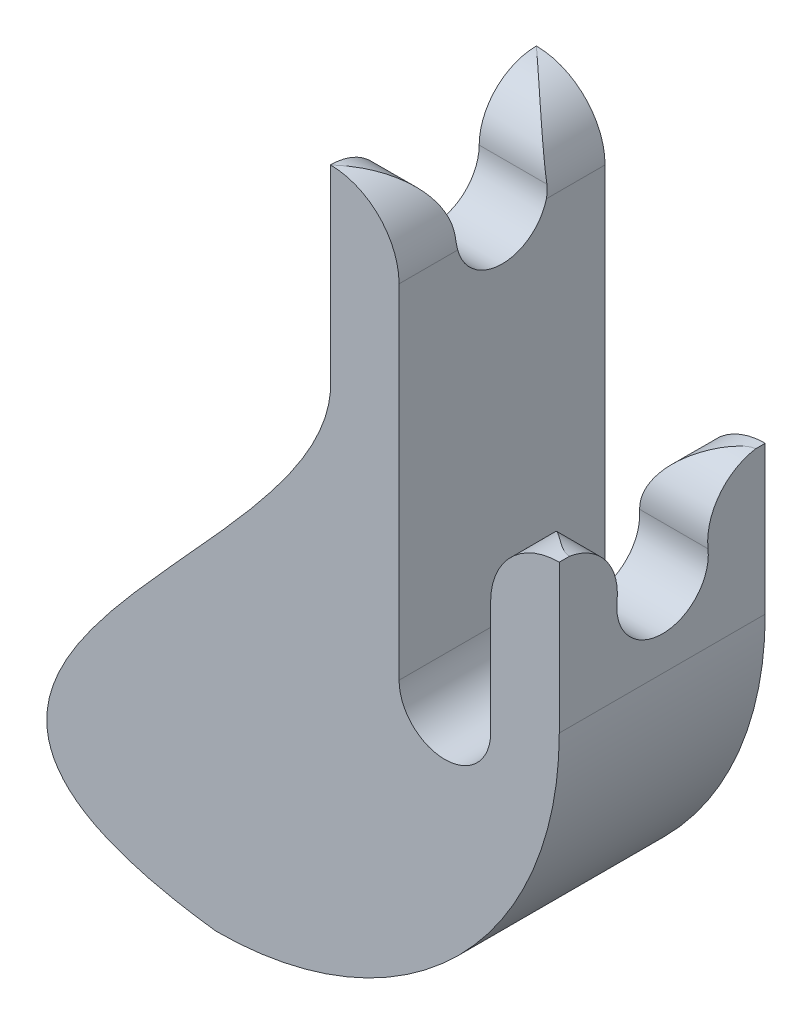
ISO-10303-21;
HEADER;
FILE_DESCRIPTION(('STEP AP214'),'2;1');
FILE_NAME('part.step','',(''),(''),'','','');
FILE_SCHEMA(('AUTOMOTIVE_DESIGN { 1 0 10303 214 1 1 1 1 }'));
ENDSEC;
DATA;
#1=APPLICATION_CONTEXT('core data for automotive mechanical design processes');
#2=APPLICATION_PROTOCOL_DEFINITION('international standard','automotive_design',2000,#1);
#3=PRODUCT_CONTEXT('',#1,'mechanical');
#4=PRODUCT('Part','Part','',(#3));
#5=PRODUCT_RELATED_PRODUCT_CATEGORY('part','',(#4));
#6=PRODUCT_DEFINITION_FORMATION('','',#4);
#7=PRODUCT_DEFINITION_CONTEXT('part definition',#1,'design');
#8=PRODUCT_DEFINITION('design','',#6,#7);
#9=PRODUCT_DEFINITION_SHAPE('','',#8);
#10=(LENGTH_UNIT() NAMED_UNIT(*) SI_UNIT(.MILLI.,.METRE.));
#11=(NAMED_UNIT(*) PLANE_ANGLE_UNIT() SI_UNIT($,.RADIAN.));
#12=(NAMED_UNIT(*) SI_UNIT($,.STERADIAN.) SOLID_ANGLE_UNIT());
#13=UNCERTAINTY_MEASURE_WITH_UNIT(LENGTH_MEASURE(1.E-05),#10,'distance_accuracy_value','');
#14=(GEOMETRIC_REPRESENTATION_CONTEXT(3) GLOBAL_UNCERTAINTY_ASSIGNED_CONTEXT((#13)) GLOBAL_UNIT_ASSIGNED_CONTEXT((#10,
#11,#12)) REPRESENTATION_CONTEXT('',''));
#15=CARTESIAN_POINT('',(0.,0.,0.));
#16=DIRECTION('',(0.,0.,1.));
#17=DIRECTION('',(1.,0.,0.));
#18=AXIS2_PLACEMENT_3D('',#15,#16,#17);
#19=CARTESIAN_POINT('',(0.,0.,9.));
#20=DIRECTION('',(0.,0.,1.));
#21=DIRECTION('',(1.,0.,0.));
#22=AXIS2_PLACEMENT_3D('',#19,#20,#21);
#23=PLANE('',#22);
#24=DIRECTION('',(0.,1.,0.));
#25=VECTOR('',#24,1.);
#26=CARTESIAN_POINT('',(0.,0.,9.));
#27=LINE('',#26,#25);
#28=CARTESIAN_POINT('',(0.,7.5,9.));
#29=VERTEX_POINT('',#28);
#30=CARTESIAN_POINT('',(0.,13.9665918901045,9.));
#31=VERTEX_POINT('',#30);
#32=EDGE_CURVE('E283',#29,#31,#27,.T.);
#33=ORIENTED_EDGE('',*,*,#32,.T.);
#34=CARTESIAN_POINT('',(0.,10.9665918901045,9.));
#35=DIRECTION('',(0.,0.,1.));
#36=DIRECTION('',(-1.,0.,0.));
#37=AXIS2_PLACEMENT_3D('',#34,#35,#36);
#38=CIRCLE('',#37,2.99999999999998);
#39=CARTESIAN_POINT('',(-2.99999999999999,10.9665918901045,9.));
#40=VERTEX_POINT('',#39);
#41=EDGE_CURVE('E285',#31,#40,#38,.T.);
#42=ORIENTED_EDGE('',*,*,#41,.T.);
#43=DIRECTION('',(0.,-1.,0.));
#44=VECTOR('',#43,1.);
#45=CARTESIAN_POINT('',(-2.99999999999999,6.,9.));
#46=LINE('',#45,#44);
#47=CARTESIAN_POINT('',(-2.99999999999999,5.99999999999999,9.));
#48=VERTEX_POINT('',#47);
#49=EDGE_CURVE('E362',#40,#48,#46,.T.);
#50=ORIENTED_EDGE('',*,*,#49,.T.);
#51=CARTESIAN_POINT('',(-4.99999999999999,5.99999999999999,9.));
#52=DIRECTION('',(0.,0.,-1.));
#53=DIRECTION('',(1.,0.,0.));
#54=AXIS2_PLACEMENT_3D('',#51,#52,#53);
#55=CIRCLE('',#54,2.);
#56=CARTESIAN_POINT('',(-6.99999999999999,6.,9.));
#57=VERTEX_POINT('',#56);
#58=EDGE_CURVE('E365',#48,#57,#55,.T.);
#59=ORIENTED_EDGE('',*,*,#58,.T.);
#60=DIRECTION('',(0.,1.,0.));
#61=VECTOR('',#60,1.);
#62=CARTESIAN_POINT('',(-6.99999999999999,6.,9.));
#63=LINE('',#62,#61);
#64=CARTESIAN_POINT('',(-7.00000000000001,21.,9.));
#65=VERTEX_POINT('',#64);
#66=EDGE_CURVE('E367',#57,#65,#63,.T.);
#67=ORIENTED_EDGE('',*,*,#66,.T.);
#68=CARTESIAN_POINT('',(-10.,21.,9.));
#69=DIRECTION('',(0.,0.,1.));
#70=DIRECTION('',(1.,0.,0.));
#71=AXIS2_PLACEMENT_3D('',#68,#69,#70);
#72=CIRCLE('',#71,3.00000000000002);
#73=CARTESIAN_POINT('',(-9.99999999999983,24.,9.));
#74=VERTEX_POINT('',#73);
#75=EDGE_CURVE('E343',#65,#74,#72,.T.);
#76=ORIENTED_EDGE('',*,*,#75,.T.);
#77=DIRECTION('',(0.,1.,0.));
#78=VECTOR('',#77,1.);
#79=CARTESIAN_POINT('',(-9.99999999999979,0.,9.));
#80=LINE('',#79,#78);
#81=CARTESIAN_POINT('',(-10.,15.4143003152786,9.00000000000001));
#82=VERTEX_POINT('',#81);
#83=EDGE_CURVE('E11',#82,#74,#80,.T.);
#84=ORIENTED_EDGE('',*,*,#83,.F.);
#85=CARTESIAN_POINT('',(-10.,15.4143003152786,9.00000000000001));
#86=CARTESIAN_POINT('',(-10.6888579902021,7.78047139706958,9.00000000000001));
#87=CARTESIAN_POINT('',(-33.9007527158929,-5.1147055231354,9.00000000000001));
#88=CARTESIAN_POINT('',(-15.,-7.5,9.00000000000001));
#89=B_SPLINE_CURVE_WITH_KNOTS('',3,(#85,#86,#87,#88),.UNSPECIFIED.,.F.,.F.,(4,4),(0.,1.),.UNSPECIFIED.);
#90=CARTESIAN_POINT('',(-15.,-7.5,9.));
#91=VERTEX_POINT('',#90);
#92=EDGE_CURVE('E291',#82,#91,#89,.T.);
#93=ORIENTED_EDGE('',*,*,#92,.T.);
#94=CARTESIAN_POINT('',(-15.,7.5,9.));
#95=DIRECTION('',(0.,0.,1.));
#96=DIRECTION('',(1.,0.,0.));
#97=AXIS2_PLACEMENT_3D('',#94,#95,#96);
#98=CIRCLE('',#97,15.);
#99=EDGE_CURVE('E79',#91,#29,#98,.T.);
#100=ORIENTED_EDGE('',*,*,#99,.T.);
#101=EDGE_LOOP('',(#33,#42,#50,#59,#67,#76,#84,#93,#100));
#102=FACE_BOUND('',#101,.T.);
#103=ADVANCED_FACE('F34',(#102),#23,.T.);
#104=CARTESIAN_POINT('',(0.,0.,0.));
#105=DIRECTION('',(0.,0.,1.));
#106=DIRECTION('',(1.,0.,0.));
#107=AXIS2_PLACEMENT_3D('',#104,#105,#106);
#108=PLANE('',#107);
#109=CARTESIAN_POINT('',(-10.,21.,0.));
#110=DIRECTION('',(0.,0.,1.));
#111=DIRECTION('',(1.,0.,0.));
#112=AXIS2_PLACEMENT_3D('',#109,#110,#111);
#113=CIRCLE('',#112,3.00000000000002);
#114=CARTESIAN_POINT('',(-7.00000000000001,21.,0.));
#115=VERTEX_POINT('',#114);
#116=CARTESIAN_POINT('',(-9.99999999999983,24.,0.));
#117=VERTEX_POINT('',#116);
#118=EDGE_CURVE('E354',#115,#117,#113,.T.);
#119=ORIENTED_EDGE('',*,*,#118,.F.);
#120=DIRECTION('',(0.,1.,0.));
#121=VECTOR('',#120,1.);
#122=CARTESIAN_POINT('',(-6.99999999999999,6.,0.));
#123=LINE('',#122,#121);
#124=CARTESIAN_POINT('',(-6.99999999999999,6.,0.));
#125=VERTEX_POINT('',#124);
#126=EDGE_CURVE('E334',#125,#115,#123,.T.);
#127=ORIENTED_EDGE('',*,*,#126,.F.);
#128=CARTESIAN_POINT('',(-4.99999999999999,5.99999999999999,0.));
#129=DIRECTION('',(0.,0.,-1.));
#130=DIRECTION('',(1.,0.,0.));
#131=AXIS2_PLACEMENT_3D('',#128,#129,#130);
#132=CIRCLE('',#131,2.);
#133=CARTESIAN_POINT('',(-2.99999999999999,5.99999999999999,0.));
#134=VERTEX_POINT('',#133);
#135=EDGE_CURVE('E357',#134,#125,#132,.T.);
#136=ORIENTED_EDGE('',*,*,#135,.F.);
#137=DIRECTION('',(0.,-1.,0.));
#138=VECTOR('',#137,1.);
#139=CARTESIAN_POINT('',(-2.99999999999999,6.,0.));
#140=LINE('',#139,#138);
#141=CARTESIAN_POINT('',(-2.99999999999999,10.9665918901045,0.));
#142=VERTEX_POINT('',#141);
#143=EDGE_CURVE('E373',#142,#134,#140,.T.);
#144=ORIENTED_EDGE('',*,*,#143,.F.);
#145=CARTESIAN_POINT('',(0.,10.9665918901045,0.));
#146=DIRECTION('',(0.,0.,1.));
#147=DIRECTION('',(-1.,0.,0.));
#148=AXIS2_PLACEMENT_3D('',#145,#146,#147);
#149=CIRCLE('',#148,2.99999999999998);
#150=CARTESIAN_POINT('',(0.,13.9665918901045,0.));
#151=VERTEX_POINT('',#150);
#152=EDGE_CURVE('E370',#151,#142,#149,.T.);
#153=ORIENTED_EDGE('',*,*,#152,.F.);
#154=DIRECTION('',(0.,1.,0.));
#155=VECTOR('',#154,1.);
#156=CARTESIAN_POINT('',(0.,0.,0.));
#157=LINE('',#156,#155);
#158=CARTESIAN_POINT('',(0.,7.5,0.));
#159=VERTEX_POINT('',#158);
#160=EDGE_CURVE('E298',#159,#151,#157,.T.);
#161=ORIENTED_EDGE('',*,*,#160,.F.);
#162=CARTESIAN_POINT('',(-15.,7.5,0.));
#163=DIRECTION('',(0.,0.,1.));
#164=DIRECTION('',(1.,0.,0.));
#165=AXIS2_PLACEMENT_3D('',#162,#163,#164);
#166=CIRCLE('',#165,15.);
#167=CARTESIAN_POINT('',(-15.,-7.5,0.));
#168=VERTEX_POINT('',#167);
#169=EDGE_CURVE('E296',#168,#159,#166,.T.);
#170=ORIENTED_EDGE('',*,*,#169,.F.);
#171=CARTESIAN_POINT('',(-10.,15.4143003152786,0.));
#172=CARTESIAN_POINT('',(-10.6888579902021,7.78047139706958,0.));
#173=CARTESIAN_POINT('',(-33.9007527158929,-5.1147055231354,0.));
#174=CARTESIAN_POINT('',(-15.,-7.5,0.));
#175=B_SPLINE_CURVE_WITH_KNOTS('',3,(#171,#172,#173,#174),.UNSPECIFIED.,.F.,.F.,(4,4),(0.,1.),.UNSPECIFIED.);
#176=CARTESIAN_POINT('',(-9.9999999999999,15.4143003152786,0.));
#177=VERTEX_POINT('',#176);
#178=EDGE_CURVE('E44',#177,#168,#175,.T.);
#179=ORIENTED_EDGE('',*,*,#178,.F.);
#180=DIRECTION('',(0.,1.,0.));
#181=VECTOR('',#180,1.);
#182=CARTESIAN_POINT('',(-9.99999999999979,0.,0.));
#183=LINE('',#182,#181);
#184=EDGE_CURVE('E287',#177,#117,#183,.T.);
#185=ORIENTED_EDGE('',*,*,#184,.T.);
#186=EDGE_LOOP('',(#119,#127,#136,#144,#153,#161,#170,#179,#185));
#187=FACE_BOUND('',#186,.T.);
#188=ADVANCED_FACE('F246',(#187),#108,.F.);
#189=CARTESIAN_POINT('',(0.,0.,50.6242851503386));
#190=DIRECTION('',(-1.,0.,0.));
#191=DIRECTION('',(0.,0.,1.));
#192=AXIS2_PLACEMENT_3D('',#189,#190,#191);
#193=PLANE('',#192);
#194=DIRECTION('',(0.,0.,1.));
#195=VECTOR('',#194,1.);
#196=CARTESIAN_POINT('',(0.,13.9665918901045,0.));
#197=LINE('',#196,#195);
#198=CARTESIAN_POINT('',(0.,13.9665918901045,0.423395215193541));
#199=VERTEX_POINT('',#198);
#200=EDGE_CURVE('E351',#151,#199,#197,.T.);
#201=ORIENTED_EDGE('',*,*,#200,.T.);
#202=CARTESIAN_POINT('',(0.,11.500095738264,0.0154776586264697));
#203=DIRECTION('',(1.,0.,0.));
#204=DIRECTION('',(0.,0.,-1.));
#205=AXIS2_PLACEMENT_3D('',#202,#203,#204);
#206=CIRCLE('',#205,2.5);
#207=CARTESIAN_POINT('',(0.,11.2222913242989,2.4999946554654));
#208=VERTEX_POINT('',#207);
#209=EDGE_CURVE('E403',#199,#208,#206,.T.);
#210=ORIENTED_EDGE('',*,*,#209,.T.);
#211=CARTESIAN_POINT('',(0.,11.0000477931268,4.48760825293654));
#212=DIRECTION('',(1.,0.,0.));
#213=DIRECTION('',(0.,0.,-1.));
#214=AXIS2_PLACEMENT_3D('',#211,#212,#213);
#215=CIRCLE('',#214,2.);
#216=CARTESIAN_POINT('',(0.,11.2222913242989,6.47522185040768));
#217=VERTEX_POINT('',#216);
#218=EDGE_CURVE('E400',#208,#217,#215,.F.);
#219=ORIENTED_EDGE('',*,*,#218,.T.);
#220=CARTESIAN_POINT('',(0.,11.500095738264,8.95973884724661));
#221=DIRECTION('',(1.,0.,0.));
#222=DIRECTION('',(0.,0.,-1.));
#223=AXIS2_PLACEMENT_3D('',#220,#221,#222);
#224=CIRCLE('',#223,2.5);
#225=CARTESIAN_POINT('',(0.,13.9665918901045,8.55182129067954));
#226=VERTEX_POINT('',#225);
#227=EDGE_CURVE('E406',#217,#226,#224,.T.);
#228=ORIENTED_EDGE('',*,*,#227,.T.);
#229=EDGE_CURVE('E352',#226,#31,#197,.T.);
#230=ORIENTED_EDGE('',*,*,#229,.T.);
#231=ORIENTED_EDGE('',*,*,#32,.F.);
#232=DIRECTION('',(0.,0.,-1.));
#233=VECTOR('',#232,1.);
#234=CARTESIAN_POINT('',(0.,7.5,50.6242851503386));
#235=LINE('',#234,#233);
#236=EDGE_CURVE('E85',#29,#159,#235,.T.);
#237=ORIENTED_EDGE('',*,*,#236,.T.);
#238=ORIENTED_EDGE('',*,*,#160,.T.);
#239=EDGE_LOOP('',(#201,#210,#219,#228,#230,#231,#237,#238));
#240=FACE_BOUND('',#239,.T.);
#241=ADVANCED_FACE('F280',(#240),#193,.F.);
#242=CARTESIAN_POINT('',(-15.,7.5,50.6242851503386));
#243=DIRECTION('',(0.,0.,-1.));
#244=DIRECTION('',(-1.,0.,0.));
#245=AXIS2_PLACEMENT_3D('',#242,#243,#244);
#246=CYLINDRICAL_SURFACE('',#245,15.);
#247=ORIENTED_EDGE('',*,*,#99,.F.);
#248=DIRECTION('',(0.,0.,-1.));
#249=VECTOR('',#248,1.);
#250=CARTESIAN_POINT('',(-15.,-7.5,50.6242851503386));
#251=LINE('',#250,#249);
#252=EDGE_CURVE('E297',#91,#168,#251,.T.);
#253=ORIENTED_EDGE('',*,*,#252,.T.);
#254=ORIENTED_EDGE('',*,*,#169,.T.);
#255=ORIENTED_EDGE('',*,*,#236,.F.);
#256=EDGE_LOOP('',(#247,#253,#254,#255));
#257=FACE_BOUND('',#256,.T.);
#258=ADVANCED_FACE('F389',(#257),#246,.T.);
#259=CARTESIAN_POINT('',(-10.,15.4143003152786,50.6242851503386));
#260=CARTESIAN_POINT('',(-10.6888579902021,7.78047139706958,50.6242851503386));
#261=CARTESIAN_POINT('',(-33.9007527158929,-5.1147055231354,50.6242851503386));
#262=CARTESIAN_POINT('',(-15.,-7.5,50.6242851503386));
#263=B_SPLINE_CURVE_WITH_KNOTS('',3,(#259,#260,#261,#262),.UNSPECIFIED.,.F.,.F.,(4,4),(0.,1.),.UNSPECIFIED.);
#264=DIRECTION('',(0.,0.,-1.));
#265=VECTOR('',#264,1.);
#266=SURFACE_OF_LINEAR_EXTRUSION('',#263,#265);
#267=ORIENTED_EDGE('',*,*,#92,.F.);
#268=DIRECTION('',(0.,0.,-1.));
#269=VECTOR('',#268,1.);
#270=CARTESIAN_POINT('',(-9.9999999999999,15.4143003152786,50.6242851503386));
#271=LINE('',#270,#269);
#272=EDGE_CURVE('E61',#82,#177,#271,.T.);
#273=ORIENTED_EDGE('',*,*,#272,.T.);
#274=ORIENTED_EDGE('',*,*,#178,.T.);
#275=ORIENTED_EDGE('',*,*,#252,.F.);
#276=EDGE_LOOP('',(#267,#273,#274,#275));
#277=FACE_BOUND('',#276,.T.);
#278=ADVANCED_FACE('F387',(#277),#266,.F.);
#279=CARTESIAN_POINT('',(-9.99999999999979,0.,50.6242851503386));
#280=DIRECTION('',(-1.,0.,0.));
#281=DIRECTION('',(0.,-1.,0.));
#282=AXIS2_PLACEMENT_3D('',#279,#280,#281);
#283=PLANE('',#282);
#284=CARTESIAN_POINT('',(-9.99999999999983,21.5,0.));
#285=DIRECTION('',(-1.,0.,0.));
#286=DIRECTION('',(0.,-1.,0.));
#287=AXIS2_PLACEMENT_3D('',#284,#285,#286);
#288=CIRCLE('',#287,2.5);
#289=CARTESIAN_POINT('',(-9.99999999999994,21.5,2.5));
#290=VERTEX_POINT('',#289);
#291=EDGE_CURVE('E52',#117,#290,#288,.F.);
#292=ORIENTED_EDGE('',*,*,#291,.F.);
#293=ORIENTED_EDGE('',*,*,#184,.F.);
#294=ORIENTED_EDGE('',*,*,#272,.F.);
#295=ORIENTED_EDGE('',*,*,#83,.T.);
#296=CARTESIAN_POINT('',(-9.99999999999983,21.5,9.));
#297=DIRECTION('',(-1.,0.,0.));
#298=DIRECTION('',(0.,-1.,0.));
#299=AXIS2_PLACEMENT_3D('',#296,#297,#298);
#300=CIRCLE('',#299,2.5);
#301=CARTESIAN_POINT('',(-9.99999999999983,21.5,6.5));
#302=VERTEX_POINT('',#301);
#303=EDGE_CURVE('E168',#302,#74,#300,.F.);
#304=ORIENTED_EDGE('',*,*,#303,.F.);
#305=CARTESIAN_POINT('',(-9.99999999999983,21.5,4.5));
#306=DIRECTION('',(-1.,0.,0.));
#307=DIRECTION('',(0.,-1.,0.));
#308=AXIS2_PLACEMENT_3D('',#305,#306,#307);
#309=CIRCLE('',#308,2.);
#310=EDGE_CURVE('E176',#290,#302,#309,.T.);
#311=ORIENTED_EDGE('',*,*,#310,.F.);
#312=EDGE_LOOP('',(#292,#293,#294,#295,#304,#311));
#313=FACE_BOUND('',#312,.T.);
#314=ADVANCED_FACE('F181',(#313),#283,.T.);
#315=CARTESIAN_POINT('',(-10.,21.,0.));
#316=DIRECTION('',(0.,0.,1.));
#317=DIRECTION('',(1.,0.,0.));
#318=AXIS2_PLACEMENT_3D('',#315,#316,#317);
#319=CYLINDRICAL_SURFACE('',#318,3.00000000000002);
#320=DIRECTION('',(0.,0.,1.));
#321=VECTOR('',#320,1.);
#322=CARTESIAN_POINT('',(-7.00000000000001,21.,0.));
#323=LINE('',#322,#321);
#324=CARTESIAN_POINT('',(-6.99999999999999,21.,2.56350832689629));
#325=VERTEX_POINT('',#324);
#326=EDGE_CURVE('E331',#115,#325,#323,.T.);
#327=ORIENTED_EDGE('',*,*,#326,.F.);
#328=ORIENTED_EDGE('',*,*,#118,.T.);
#329=CARTESIAN_POINT('',(-7.00000000000001,21.,2.44948974278318));
#330=CARTESIAN_POINT('',(-6.99998742998083,21.0563376934837,2.46100211138585));
#331=CARTESIAN_POINT('',(-7.00158670206383,21.1130764980745,2.47054692955581));
#332=CARTESIAN_POINT('',(-7.00805166206358,21.2268756810035,2.48569528447392));
#333=CARTESIAN_POINT('',(-7.01291636663432,21.2839359574063,2.49130000669502));
#334=CARTESIAN_POINT('',(-7.02591371539805,21.3975721513124,2.49854598416605));
#335=CARTESIAN_POINT('',(-7.03402553932373,21.4541488527867,2.50021203260322));
#336=CARTESIAN_POINT('',(-7.05345940788789,21.56671634434,2.49974443158925));
#337=CARTESIAN_POINT('',(-7.06478149009232,21.6227071275549,2.49761073767256));
#338=CARTESIAN_POINT('',(-7.10340758883614,21.7890869661023,2.48570818986833));
#339=CARTESIAN_POINT('',(-7.13539315555968,21.8980715010528,2.47044892261803));
#340=CARTESIAN_POINT('',(-7.21041691929882,22.1094484797481,2.4269895555281));
#341=CARTESIAN_POINT('',(-7.25347100872214,22.2118311778303,2.39877080199836));
#342=CARTESIAN_POINT('',(-7.36387612880823,22.4392462414423,2.32086892701718));
#343=CARTESIAN_POINT('',(-7.43461045761862,22.5612812518257,2.26722692248985));
#344=CARTESIAN_POINT('',(-7.5882321411152,22.7895252935822,2.14567561701329));
#345=CARTESIAN_POINT('',(-7.67114047574163,22.8957063529955,2.07774159681181));
#346=CARTESIAN_POINT('',(-7.87849098432977,23.1287961147929,1.90402603217392));
#347=CARTESIAN_POINT('',(-8.00689442284106,23.2486751604971,1.79357636702867));
#348=CARTESIAN_POINT('',(-8.27472016633018,23.4602111487546,1.55965529782916));
#349=CARTESIAN_POINT('',(-8.41416552898433,23.5518069676555,1.43615645474933));
#350=CARTESIAN_POINT('',(-8.65554594818163,23.6842212105117,1.2205798654395));
#351=CARTESIAN_POINT('',(-8.75568950189065,23.7319759239391,1.13064734155705));
#352=CARTESIAN_POINT('',(-8.95836892642721,23.815498378878,0.947928486503034));
#353=CARTESIAN_POINT('',(-9.06090590324299,23.8512604564817,0.855140829424433));
#354=CARTESIAN_POINT('',(-9.37055723455384,23.941077134902,0.57423297181827));
#355=CARTESIAN_POINT('',(-9.58025054656133,23.9779479859016,0.383084298648085));
#356=CARTESIAN_POINT('',(-9.85748094047768,23.9973680551402,0.130100239601671));
#357=CARTESIAN_POINT('',(-9.92468972897536,23.9998078445581,0.0687485082595723));
#358=CARTESIAN_POINT('',(-9.99460638338219,23.9999963622776,0.00492367637716682));
#359=CARTESIAN_POINT('',(-9.99730318362099,23.9999999984968,0.00246184585870002));
#360=CARTESIAN_POINT('',(-10.,24.,0.));
#361=B_SPLINE_CURVE_WITH_KNOTS('',3,(#329,#330,#331,#332,#333,#334,#335,#336,#337,#338,#339,
#340,#341,#342,#343,#344,#345,#346,#347,#348,#349,#350,#351,#352,#353,#354,#355,#356,#357,#358,
#359,#360),.UNSPECIFIED.,.F.,.F.,(4,2,2,2,2,2,2,2,2,2,2,2,2,2,2,4),(0.,0.172446606833627,
0.344841306712753,0.516147891840093,0.68745648165426,1.02951260779813,1.37206263501981,
1.82229521215194,2.27331300261686,2.89246941758283,3.51295469170279,3.94084895449556,
4.36894502042942,5.22283032173138,5.49588059432551,5.5068350509076),.UNSPECIFIED.);
#362=CARTESIAN_POINT('',(-7.0419601084502,21.5,2.5));
#363=VERTEX_POINT('',#362);
#364=EDGE_CURVE('E304',#363,#117,#361,.T.);
#365=ORIENTED_EDGE('',*,*,#364,.F.);
#366=CARTESIAN_POINT('',(-7.00000000000001,21.,2.56350832689629));
#367=CARTESIAN_POINT('',(-6.99999489109899,21.0410798203284,2.55289637963894));
#368=CARTESIAN_POINT('',(-7.00084379241101,21.082501048675,2.54360103463431));
#369=CARTESIAN_POINT('',(-7.00428549717784,21.1655419088187,2.52771461538202));
#370=CARTESIAN_POINT('',(-7.00686833489442,21.2071590647376,2.52110843188588));
#371=CARTESIAN_POINT('',(-7.0138127555907,21.2905812072091,2.51054995409249));
#372=CARTESIAN_POINT('',(-7.01817433875082,21.3323861937807,2.50659766006442));
#373=CARTESIAN_POINT('',(-7.02870457356117,21.416178743374,2.50131259599066));
#374=CARTESIAN_POINT('',(-7.03488343890187,21.458165979576,2.49999496920957));
#375=CARTESIAN_POINT('',(-7.0419601084502,21.5,2.5));
#376=B_SPLINE_CURVE_WITH_KNOTS('',3,(#366,#367,#368,#369,#370,#371,#372,#373,#374,#375),
.UNSPECIFIED.,.F.,.F.,(4,2,2,2,4),(0.,0.12725678234551,0.253788352324273,0.380319935136128,
0.50757671613107),.UNSPECIFIED.);
#377=EDGE_CURVE('E194',#325,#363,#376,.T.);
#378=ORIENTED_EDGE('',*,*,#377,.F.);
#379=EDGE_LOOP('',(#327,#328,#365,#378));
#380=FACE_BOUND('',#379,.T.);
#381=ADVANCED_FACE('F242',(#380),#319,.T.);
#382=CARTESIAN_POINT('',(0.,10.9665918901045,0.));
#383=DIRECTION('',(0.,0.,1.));
#384=DIRECTION('',(1.,0.,0.));
#385=AXIS2_PLACEMENT_3D('',#382,#383,#384);
#386=CYLINDRICAL_SURFACE('',#385,2.99999999999998);
#387=CARTESIAN_POINT('',(-2.99999999999999,10.9665918901045,2.457889098986));
#388=CARTESIAN_POINT('',(-3.00001240808851,11.0226683304486,2.47015047063632));
#389=CARTESIAN_POINT('',(-2.99842796839262,11.079171822714,2.4804570652047));
#390=CARTESIAN_POINT('',(-2.99201337910549,11.1925565979758,2.4971477833259));
#391=CARTESIAN_POINT('',(-2.98718411699204,11.249437773463,2.50353297849053));
#392=CARTESIAN_POINT('',(-2.97426760035181,11.3627846724221,2.51234762633171));
#393=CARTESIAN_POINT('',(-2.96620047663224,11.4192508070768,2.51480106187646));
#394=CARTESIAN_POINT('',(-2.94685693651197,11.5316520055348,2.51591131225407));
#395=CARTESIAN_POINT('',(-2.93558050718116,11.5875870671973,2.51456811179031));
#396=CARTESIAN_POINT('',(-2.89707573409779,11.7538931772947,2.50502990881812));
#397=CARTESIAN_POINT('',(-2.86515211198512,11.8629377532267,2.49133887174387));
#398=CARTESIAN_POINT('',(-2.79016718366145,12.0745822842306,2.45097219671522));
#399=CARTESIAN_POINT('',(-2.74709113005478,12.1771734807067,2.42427932430122));
#400=CARTESIAN_POINT('',(-2.63679358340752,12.4045772861614,2.35005857488365));
#401=CARTESIAN_POINT('',(-2.56622183168044,12.52649896844,2.29864539732219));
#402=CARTESIAN_POINT('',(-2.41276360488593,12.7547744728268,2.18165429406449));
#403=CARTESIAN_POINT('',(-2.32985354076486,12.8610976822538,2.11604912389943));
#404=CARTESIAN_POINT('',(-2.12213148960405,13.0948014511209,1.94799808469726));
#405=CARTESIAN_POINT('',(-1.99322569499445,13.2152425473149,1.84093846866329));
#406=CARTESIAN_POINT('',(-1.79122082495114,13.3746854878459,1.671362550095));
#407=CARTESIAN_POINT('',(-1.72236716704995,13.4243380669822,1.61327306442015));
#408=CARTESIAN_POINT('',(-1.58214239477828,13.5168609454335,1.49476847440696));
#409=CARTESIAN_POINT('',(-1.51077195205265,13.5597330377288,1.43435399014499));
#410=CARTESIAN_POINT('',(-1.36347836433698,13.6402042718462,1.30992779318252));
#411=CARTESIAN_POINT('',(-1.28748264089654,13.6775868208148,1.24586298083674));
#412=CARTESIAN_POINT('',(-1.13319407887304,13.7456173800637,1.11682097500066));
#413=CARTESIAN_POINT('',(-1.05489965952257,13.7762606267869,1.05184317047143));
#414=CARTESIAN_POINT('',(-0.895745430425734,13.8309855240288,0.922060211370884));
#415=CARTESIAN_POINT('',(-0.814883107295498,13.8550605100013,0.857255297738658));
#416=CARTESIAN_POINT('',(-0.690917074388361,13.8862558766099,0.762044168786365));
#417=CARTESIAN_POINT('',(-0.649174822610743,13.8958306495972,0.730657600582444));
#418=CARTESIAN_POINT('',(-0.564434610757512,13.9133340818778,0.669157182710397));
#419=CARTESIAN_POINT('',(-0.521437156120783,13.9212633936063,0.639042832387035));
#420=CARTESIAN_POINT('',(-0.436236554750773,13.9349996843601,0.58295061084661));
#421=CARTESIAN_POINT('',(-0.39414314465736,13.9409061494577,0.556832663085798));
#422=CARTESIAN_POINT('',(-0.307919403635846,13.9510617492344,0.508783827902718));
#423=CARTESIAN_POINT('',(-0.263815489473868,13.9553278380367,0.486811373524335));
#424=CARTESIAN_POINT('',(-0.183683715777352,13.9611571224186,0.455226273441446));
#425=CARTESIAN_POINT('',(-0.148419827353036,13.9631304693237,0.443894443857247));
#426=CARTESIAN_POINT('',(-0.0756292306005337,13.9658688346996,0.427806213292819));
#427=CARTESIAN_POINT('',(-0.0380696843458734,13.9666060877078,0.423201196968843));
#428=CARTESIAN_POINT('',(1.96970531430875E-12,13.9665918901047,0.423395215198552));
#429=B_SPLINE_CURVE_WITH_KNOTS('',3,(#387,#388,#389,#390,#391,#392,#393,#394,#395,#396,#397,
#398,#399,#400,#401,#402,#403,#404,#405,#406,#407,#408,#409,#410,#411,#412,#413,#414,#415,#416,
#417,#418,#419,#420,#421,#422,#423,#424,#425,#426,#427,#428),.UNSPECIFIED.,.F.,.F.,(4,2,2,2,2,2,
2,2,2,2,2,2,2,2,2,2,2,2,2,2,4),(0.,0.172146137943113,0.344245212071778,0.515290468306649,
0.686336413682914,1.02791275989919,1.36994311665466,1.81734311381163,2.26560973284643,
2.88108913355511,3.18948404247027,3.49779726493835,3.81612830736177,4.13468363842583,
4.4535610025355,4.61281358017552,4.77200289207013,4.92154642857618,5.06949991573708,
5.18018625548992,5.29332710109645),.UNSPECIFIED.);
#430=CARTESIAN_POINT('',(-2.98908310345373,11.2222913242989,2.4999946554654));
#431=VERTEX_POINT('',#430);
#432=EDGE_CURVE('E220',#431,#199,#429,.T.);
#433=ORIENTED_EDGE('',*,*,#432,.T.);
#434=ORIENTED_EDGE('',*,*,#200,.F.);
#435=ORIENTED_EDGE('',*,*,#152,.T.);
#436=DIRECTION('',(0.,0.,1.));
#437=VECTOR('',#436,1.);
#438=CARTESIAN_POINT('',(-2.99999999999999,10.9665918901045,0.));
#439=LINE('',#438,#437);
#440=CARTESIAN_POINT('',(-2.99999999999999,10.9665918901045,2.48788809687646));
#441=VERTEX_POINT('',#440);
#442=EDGE_CURVE('E348',#142,#441,#439,.T.);
#443=ORIENTED_EDGE('',*,*,#442,.T.);
#444=CARTESIAN_POINT('',(-2.99999999999999,10.9665918901045,2.48788809687646));
#445=CARTESIAN_POINT('',(-2.99999366614282,11.0094149622439,2.48717940749335));
#446=CARTESIAN_POINT('',(-2.99908075783539,11.0521347844963,2.48783394268419));
#447=CARTESIAN_POINT('',(-2.99544179231999,11.1373679292277,2.49186946221381));
#448=CARTESIAN_POINT('',(-2.992715735112,11.1798812517068,2.49525044655261));
#449=CARTESIAN_POINT('',(-2.98908310345374,11.2222913242989,2.49999465546539));
#450=B_SPLINE_CURVE_WITH_KNOTS('',3,(#444,#445,#446,#447,#448,#449),.UNSPECIFIED.,.F.,.F.,(4,2,
4),(0.,0.128203764689458,0.256407529380108),.UNSPECIFIED.);
#451=EDGE_CURVE('E229',#441,#431,#450,.T.);
#452=ORIENTED_EDGE('',*,*,#451,.T.);
#453=EDGE_LOOP('',(#433,#434,#435,#443,#452));
#454=FACE_BOUND('',#453,.T.);
#455=ADVANCED_FACE('F236',(#454),#386,.T.);
#456=CARTESIAN_POINT('',(0.,13.9665918901045,8.55182129067954));
#457=CARTESIAN_POINT('',(-0.0394204371814102,13.9666061955092,8.55202021193069));
#458=CARTESIAN_POINT('',(-0.0782623176097904,13.9658164882546,8.54708504181701));
#459=CARTESIAN_POINT('',(-0.153398200539624,13.9628935743672,8.5299534093555));
#460=CARTESIAN_POINT('',(-0.189730388573484,13.9607919268836,8.51792787486201));
#461=CARTESIAN_POINT('',(-0.268209849488366,13.9548965827817,8.48618422559455));
#462=CARTESIAN_POINT('',(-0.309844370773657,13.9508298724371,8.46534806761644));
#463=CARTESIAN_POINT('',(-0.391020711292392,13.941278985449,8.4201352378053));
#464=CARTESIAN_POINT('',(-0.430557320960105,13.9357914624822,8.39575026793908));
#465=CARTESIAN_POINT('',(-0.548649723032983,13.9170942302124,8.31871317609003));
#466=CARTESIAN_POINT('',(-0.624906142751024,13.9017987215757,8.26309856862378));
#467=CARTESIAN_POINT('',(-0.785026054422799,13.8633829733666,8.14146749712659));
#468=CARTESIAN_POINT('',(-0.868413794698403,13.8394555588429,8.07510245889174));
#469=CARTESIAN_POINT('',(-1.03256148999818,13.7846238416252,7.94183470437267));
#470=CARTESIAN_POINT('',(-1.11331912134699,13.7537135512322,7.874931574447));
#471=CARTESIAN_POINT('',(-1.27175402426656,13.6850516505487,7.74257661755527));
#472=CARTESIAN_POINT('',(-1.34945235093736,13.64736354177,7.67711716759762));
#473=CARTESIAN_POINT('',(-1.50236894680333,13.5647515034064,7.54797750611269));
#474=CARTESIAN_POINT('',(-1.57758820240422,13.5198304946599,7.48429658849671));
#475=CARTESIAN_POINT('',(-1.77732335385061,13.3881368305906,7.31550008592206));
#476=CARTESIAN_POINT('',(-1.89925614248725,13.2941672392513,7.21278265624231));
#477=CARTESIAN_POINT('',(-2.132265824034,13.0827571490545,7.01919251875267));
#478=CARTESIAN_POINT('',(-2.24333711004112,12.965304622134,6.92832592056323));
#479=CARTESIAN_POINT('',(-2.42445697539262,12.7379368325806,6.78461828660254));
#480=CARTESIAN_POINT('',(-2.49789771360001,12.6331926241699,6.72791107673496));
#481=CARTESIAN_POINT('',(-2.63294253417418,12.4103735380101,6.62816656374207));
#482=CARTESIAN_POINT('',(-2.69456378912794,12.2923184021825,6.58510936810286));
#483=CARTESIAN_POINT('',(-2.79372232998191,12.0655762281095,6.52218562601444));
#484=CARTESIAN_POINT('',(-2.8335664625975,11.9586467838712,6.49963845625152));
#485=CARTESIAN_POINT('',(-2.90109145475556,11.7391046048518,6.46873729864569));
#486=CARTESIAN_POINT('',(-2.92879627110689,11.626503557317,6.46035526176628));
#487=CARTESIAN_POINT('',(-2.95878685814442,11.464589577842,6.45952345694197));
#488=CARTESIAN_POINT('',(-2.96651903767015,11.4162133708161,6.46067460841572));
#489=CARTESIAN_POINT('',(-2.97959313765199,11.3193107375241,6.46581288085924));
#490=CARTESIAN_POINT('',(-2.98493609963516,11.270784386018,6.46979876412296));
#491=CARTESIAN_POINT('',(-2.98908310345374,11.2222913242989,6.47522185040762));
#492=B_SPLINE_CURVE_WITH_KNOTS('',3,(#456,#457,#458,#459,#460,#461,#462,#463,#464,#465,#466,
#467,#468,#469,#470,#471,#472,#473,#474,#475,#476,#477,#478,#479,#480,#481,#482,#483,#484,#485,
#486,#487,#488,#489,#490,#491),.UNSPECIFIED.,.F.,.F.,(4,2,2,2,2,2,2,2,2,2,2,2,2,2,2,2,2,4),(0.,
0.117062275714894,0.231411682850094,0.371291271726661,0.511503352708935,0.797913123178761,
1.12536396516311,1.45309666377117,1.7779052101187,2.10258291754366,2.65588003546146,
3.20946128399702,3.62777433462915,4.04547493435103,4.39300946801393,4.73985502258003,
4.88674874347749,5.03357836670049),.UNSPECIFIED.);
#493=CARTESIAN_POINT('',(-2.98908310345373,11.2222913242989,6.47522185040768));
#494=VERTEX_POINT('',#493);
#495=EDGE_CURVE('E258',#226,#494,#492,.T.);
#496=ORIENTED_EDGE('',*,*,#495,.T.);
#497=CARTESIAN_POINT('',(-2.98908310345373,11.2222913242989,6.47522185040768));
#498=CARTESIAN_POINT('',(-2.992715735112,11.1798812517068,6.47996605932046));
#499=CARTESIAN_POINT('',(-2.99544179231999,11.1373679292277,6.48334704365926));
#500=CARTESIAN_POINT('',(-2.9990807578354,11.0521347844963,6.48738256318889));
#501=CARTESIAN_POINT('',(-2.99999366614283,11.0094149622439,6.48803709837975));
#502=CARTESIAN_POINT('',(-3.00000000000001,10.9665918901045,6.48732840899666));
#503=B_SPLINE_CURVE_WITH_KNOTS('',3,(#497,#498,#499,#500,#501,#502),.UNSPECIFIED.,.F.,.F.,(4,2,
4),(0.,0.128203764690647,0.256407529380103),.UNSPECIFIED.);
#504=CARTESIAN_POINT('',(-2.99999999999999,10.9665918901045,6.48732840899662));
#505=VERTEX_POINT('',#504);
#506=EDGE_CURVE('E251',#494,#505,#503,.T.);
#507=ORIENTED_EDGE('',*,*,#506,.T.);
#508=EDGE_CURVE('E350',#505,#40,#439,.T.);
#509=ORIENTED_EDGE('',*,*,#508,.T.);
#510=ORIENTED_EDGE('',*,*,#41,.F.);
#511=ORIENTED_EDGE('',*,*,#229,.F.);
#512=EDGE_LOOP('',(#496,#507,#509,#510,#511));
#513=FACE_BOUND('',#512,.T.);
#514=ADVANCED_FACE('F241',(#513),#386,.T.);
#515=CARTESIAN_POINT('',(-7.00000000000001,21.,6.55051025721682));
#516=CARTESIAN_POINT('',(-6.99998742998083,21.0563376934837,6.53899788861415));
#517=CARTESIAN_POINT('',(-7.00158670206383,21.1130764980745,6.52945307044419));
#518=CARTESIAN_POINT('',(-7.00805166206358,21.2268756810035,6.51430471552608));
#519=CARTESIAN_POINT('',(-7.01291636663432,21.2839359574063,6.50869999330498));
#520=CARTESIAN_POINT('',(-7.02591371539804,21.3975721513124,6.50145401583396));
#521=CARTESIAN_POINT('',(-7.03402553932373,21.4541488527867,6.49978796739679));
#522=CARTESIAN_POINT('',(-7.05345940788789,21.56671634434,6.50025556841075));
#523=CARTESIAN_POINT('',(-7.06478149009232,21.6227071275549,6.50238926232745));
#524=CARTESIAN_POINT('',(-7.10340758883614,21.7890869661023,6.51429181013168));
#525=CARTESIAN_POINT('',(-7.13539315555968,21.8980715010528,6.52955107738198));
#526=CARTESIAN_POINT('',(-7.21041691929882,22.1094484797481,6.57301044447191));
#527=CARTESIAN_POINT('',(-7.25347100872214,22.2118311778303,6.60122919800164));
#528=CARTESIAN_POINT('',(-7.36387612880823,22.4392462414423,6.67913107298283));
#529=CARTESIAN_POINT('',(-7.43461045761862,22.5612812518257,6.73277307751015));
#530=CARTESIAN_POINT('',(-7.5882321411152,22.7895252935822,6.85432438298671));
#531=CARTESIAN_POINT('',(-7.67114047574162,22.8957063529955,6.92225840318819));
#532=CARTESIAN_POINT('',(-7.87849098432977,23.1287961147929,7.09597396782608));
#533=CARTESIAN_POINT('',(-8.00689442284106,23.2486751604971,7.20642363297133));
#534=CARTESIAN_POINT('',(-8.27472016633018,23.4602111487546,7.44034470217083));
#535=CARTESIAN_POINT('',(-8.41416552898434,23.5518069676555,7.56384354525065));
#536=CARTESIAN_POINT('',(-8.65554594818161,23.6842212105117,7.77942013456051));
#537=CARTESIAN_POINT('',(-8.7556895018906,23.7319759239391,7.86935265844299));
#538=CARTESIAN_POINT('',(-8.95836892642724,23.815498378878,8.05207151349691));
#539=CARTESIAN_POINT('',(-9.06090590324313,23.8512604564817,8.1448591705754));
#540=CARTESIAN_POINT('',(-9.37055723455353,23.941077134902,8.42576702818205));
#541=CARTESIAN_POINT('',(-9.58025054655971,23.9779479859016,8.61691570135367));
#542=CARTESIAN_POINT('',(-9.85748094047819,23.9973680551402,8.86989976039776));
#543=CARTESIAN_POINT('',(-9.92468972897669,23.9998078445581,8.93125149173897));
#544=CARTESIAN_POINT('',(-9.99460638338229,23.9999963622776,8.99507632362272));
#545=CARTESIAN_POINT('',(-9.99730318362104,23.9999999984968,8.99753815414124));
#546=CARTESIAN_POINT('',(-10.,24.,9.));
#547=B_SPLINE_CURVE_WITH_KNOTS('',3,(#515,#516,#517,#518,#519,#520,#521,#522,#523,#524,#525,
#526,#527,#528,#529,#530,#531,#532,#533,#534,#535,#536,#537,#538,#539,#540,#541,#542,#543,#544,
#545,#546),.UNSPECIFIED.,.F.,.F.,(4,2,2,2,2,2,2,2,2,2,2,2,2,2,2,4),(0.,0.172446606833627,
0.344841306712749,0.5161478918401,0.687456481654256,1.02951260779813,1.3720626350198,
1.82229521215193,2.27331300261686,2.89246941758282,3.51295469170278,3.94084895449554,
4.3689450204294,5.22283032173137,5.49588059432551,5.5068350509076),.UNSPECIFIED.);
#548=CARTESIAN_POINT('',(-7.0419601084502,21.5,6.5));
#549=VERTEX_POINT('',#548);
#550=EDGE_CURVE('E170',#74,#549,#547,.F.);
#551=ORIENTED_EDGE('',*,*,#550,.F.);
#552=ORIENTED_EDGE('',*,*,#75,.F.);
#553=CARTESIAN_POINT('',(-6.99999999999999,21.,6.43649167310371));
#554=VERTEX_POINT('',#553);
#555=EDGE_CURVE('E337',#554,#65,#323,.T.);
#556=ORIENTED_EDGE('',*,*,#555,.F.);
#557=CARTESIAN_POINT('',(-7.0419601084502,21.5,6.5));
#558=CARTESIAN_POINT('',(-7.03488343890187,21.458165979576,6.50000503079044));
#559=CARTESIAN_POINT('',(-7.02870457356117,21.416178743374,6.49868740400935));
#560=CARTESIAN_POINT('',(-7.01817433875082,21.3323861937807,6.49340233993558));
#561=CARTESIAN_POINT('',(-7.0138127555907,21.2905812072091,6.48945004590751));
#562=CARTESIAN_POINT('',(-7.00686833489442,21.2071590647376,6.47889156811413));
#563=CARTESIAN_POINT('',(-7.00428549717784,21.1655419088187,6.47228538461798));
#564=CARTESIAN_POINT('',(-7.00084379241101,21.082501048675,6.45639896536569));
#565=CARTESIAN_POINT('',(-6.99999489109899,21.0410798203284,6.44710362036107));
#566=CARTESIAN_POINT('',(-7.00000000000001,21.,6.43649167310371));
#567=B_SPLINE_CURVE_WITH_KNOTS('',3,(#557,#558,#559,#560,#561,#562,#563,#564,#565,#566),
.UNSPECIFIED.,.F.,.F.,(4,2,2,2,4),(0.,0.127256780994946,0.253788363806798,0.380319933785561,
0.507576716131067),.UNSPECIFIED.);
#568=EDGE_CURVE('E185',#549,#554,#567,.T.);
#569=ORIENTED_EDGE('',*,*,#568,.F.);
#570=EDGE_LOOP('',(#551,#552,#556,#569));
#571=FACE_BOUND('',#570,.T.);
#572=ADVANCED_FACE('F200',(#571),#319,.T.);
#573=CARTESIAN_POINT('',(-6.99999999999999,6.,0.));
#574=DIRECTION('',(1.,0.,0.));
#575=DIRECTION('',(0.,1.,0.));
#576=AXIS2_PLACEMENT_3D('',#573,#574,#575);
#577=PLANE('',#576);
#578=ORIENTED_EDGE('',*,*,#555,.T.);
#579=ORIENTED_EDGE('',*,*,#66,.F.);
#580=DIRECTION('',(0.,0.,1.));
#581=VECTOR('',#580,1.);
#582=CARTESIAN_POINT('',(-6.99999999999999,6.,0.));
#583=LINE('',#582,#581);
#584=EDGE_CURVE('E340',#125,#57,#583,.T.);
#585=ORIENTED_EDGE('',*,*,#584,.F.);
#586=ORIENTED_EDGE('',*,*,#126,.T.);
#587=ORIENTED_EDGE('',*,*,#326,.T.);
#588=CARTESIAN_POINT('',(-6.99999999999999,21.5,4.5));
#589=DIRECTION('',(1.,0.,0.));
#590=DIRECTION('',(0.,1.,0.));
#591=AXIS2_PLACEMENT_3D('',#588,#589,#590);
#592=CIRCLE('',#591,2.);
#593=EDGE_CURVE('E228',#554,#325,#592,.T.);
#594=ORIENTED_EDGE('',*,*,#593,.F.);
#595=EDGE_LOOP('',(#578,#579,#585,#586,#587,#594));
#596=FACE_BOUND('',#595,.T.);
#597=ADVANCED_FACE('F332',(#596),#577,.T.);
#598=CARTESIAN_POINT('',(-4.99999999999999,5.99999999999999,0.));
#599=DIRECTION('',(0.,0.,1.));
#600=DIRECTION('',(1.,0.,0.));
#601=AXIS2_PLACEMENT_3D('',#598,#599,#600);
#602=CYLINDRICAL_SURFACE('',#601,2.);
#603=ORIENTED_EDGE('',*,*,#58,.F.);
#604=DIRECTION('',(0.,0.,1.));
#605=VECTOR('',#604,1.);
#606=CARTESIAN_POINT('',(-2.99999999999999,5.99999999999999,0.));
#607=LINE('',#606,#605);
#608=EDGE_CURVE('E346',#134,#48,#607,.T.);
#609=ORIENTED_EDGE('',*,*,#608,.F.);
#610=ORIENTED_EDGE('',*,*,#135,.T.);
#611=ORIENTED_EDGE('',*,*,#584,.T.);
#612=EDGE_LOOP('',(#603,#609,#610,#611));
#613=FACE_BOUND('',#612,.T.);
#614=ADVANCED_FACE('F271',(#613),#602,.F.);
#615=CARTESIAN_POINT('',(-2.99999999999999,6.,0.));
#616=DIRECTION('',(-1.,0.,0.));
#617=DIRECTION('',(0.,0.,1.));
#618=AXIS2_PLACEMENT_3D('',#615,#616,#617);
#619=PLANE('',#618);
#620=CARTESIAN_POINT('',(-2.99999999999999,11.0000477931268,4.48760825293654));
#621=DIRECTION('',(-1.,0.,0.));
#622=DIRECTION('',(0.,0.,1.));
#623=AXIS2_PLACEMENT_3D('',#620,#621,#622);
#624=CIRCLE('',#623,2.);
#625=EDGE_CURVE('E363',#505,#441,#624,.F.);
#626=ORIENTED_EDGE('',*,*,#625,.T.);
#627=ORIENTED_EDGE('',*,*,#442,.F.);
#628=ORIENTED_EDGE('',*,*,#143,.T.);
#629=ORIENTED_EDGE('',*,*,#608,.T.);
#630=ORIENTED_EDGE('',*,*,#49,.F.);
#631=ORIENTED_EDGE('',*,*,#508,.F.);
#632=EDGE_LOOP('',(#626,#627,#628,#629,#630,#631));
#633=FACE_BOUND('',#632,.T.);
#634=ADVANCED_FACE('F244',(#633),#619,.T.);
#635=CARTESIAN_POINT('',(-5.,11.500095738264,8.95973884724661));
#636=DIRECTION('',(1.,0.,0.));
#637=DIRECTION('',(0.,0.,-1.));
#638=AXIS2_PLACEMENT_3D('',#635,#636,#637);
#639=CYLINDRICAL_SURFACE('',#638,2.5);
#640=ORIENTED_EDGE('',*,*,#227,.F.);
#641=DIRECTION('',(1.,0.,0.));
#642=VECTOR('',#641,1.);
#643=CARTESIAN_POINT('',(-5.,11.2222913242989,6.47522185040768));
#644=LINE('',#643,#642);
#645=EDGE_CURVE('E401',#494,#217,#644,.T.);
#646=ORIENTED_EDGE('',*,*,#645,.F.);
#647=ORIENTED_EDGE('',*,*,#495,.F.);
#648=EDGE_LOOP('',(#640,#646,#647));
#649=FACE_BOUND('',#648,.T.);
#650=ADVANCED_FACE('F216',(#649),#639,.T.);
#651=CARTESIAN_POINT('',(-5.,11.500095738264,0.0154776586264697));
#652=DIRECTION('',(1.,0.,0.));
#653=DIRECTION('',(0.,0.,-1.));
#654=AXIS2_PLACEMENT_3D('',#651,#652,#653);
#655=CYLINDRICAL_SURFACE('',#654,2.5);
#656=DIRECTION('',(1.,0.,0.));
#657=VECTOR('',#656,1.);
#658=CARTESIAN_POINT('',(-5.,11.2222913242989,2.4999946554654));
#659=LINE('',#658,#657);
#660=EDGE_CURVE('E398',#431,#208,#659,.T.);
#661=ORIENTED_EDGE('',*,*,#660,.T.);
#662=ORIENTED_EDGE('',*,*,#209,.F.);
#663=ORIENTED_EDGE('',*,*,#432,.F.);
#664=EDGE_LOOP('',(#661,#662,#663));
#665=FACE_BOUND('',#664,.T.);
#666=ADVANCED_FACE('F210',(#665),#655,.T.);
#667=CARTESIAN_POINT('',(-5.,11.0000477931268,4.48760825293654));
#668=DIRECTION('',(1.,0.,0.));
#669=DIRECTION('',(0.,0.,-1.));
#670=AXIS2_PLACEMENT_3D('',#667,#668,#669);
#671=CYLINDRICAL_SURFACE('',#670,2.);
#672=ORIENTED_EDGE('',*,*,#625,.F.);
#673=ORIENTED_EDGE('',*,*,#506,.F.);
#674=ORIENTED_EDGE('',*,*,#645,.T.);
#675=ORIENTED_EDGE('',*,*,#218,.F.);
#676=ORIENTED_EDGE('',*,*,#660,.F.);
#677=ORIENTED_EDGE('',*,*,#451,.F.);
#678=EDGE_LOOP('',(#672,#673,#674,#675,#676,#677));
#679=FACE_BOUND('',#678,.T.);
#680=ADVANCED_FACE('F215',(#679),#671,.F.);
#681=CARTESIAN_POINT('',(-4.99999999999983,21.5,0.));
#682=DIRECTION('',(-1.,0.,0.));
#683=DIRECTION('',(0.,-1.,0.));
#684=AXIS2_PLACEMENT_3D('',#681,#682,#683);
#685=CYLINDRICAL_SURFACE('',#684,2.5);
#686=ORIENTED_EDGE('',*,*,#364,.T.);
#687=ORIENTED_EDGE('',*,*,#291,.T.);
#688=DIRECTION('',(-1.,0.,0.));
#689=VECTOR('',#688,1.);
#690=CARTESIAN_POINT('',(-4.99999999999983,21.5,2.5));
#691=LINE('',#690,#689);
#692=EDGE_CURVE('E173',#363,#290,#691,.T.);
#693=ORIENTED_EDGE('',*,*,#692,.F.);
#694=EDGE_LOOP('',(#686,#687,#693));
#695=FACE_BOUND('',#694,.T.);
#696=ADVANCED_FACE('F515',(#695),#685,.T.);
#697=CARTESIAN_POINT('',(-4.99999999999983,21.5,9.));
#698=DIRECTION('',(-1.,0.,0.));
#699=DIRECTION('',(0.,-1.,0.));
#700=AXIS2_PLACEMENT_3D('',#697,#698,#699);
#701=CYLINDRICAL_SURFACE('',#700,2.5);
#702=ORIENTED_EDGE('',*,*,#550,.T.);
#703=DIRECTION('',(-1.,0.,0.));
#704=VECTOR('',#703,1.);
#705=CARTESIAN_POINT('',(-4.99999999999983,21.5,6.5));
#706=LINE('',#705,#704);
#707=EDGE_CURVE('E164',#549,#302,#706,.T.);
#708=ORIENTED_EDGE('',*,*,#707,.T.);
#709=ORIENTED_EDGE('',*,*,#303,.T.);
#710=EDGE_LOOP('',(#702,#708,#709));
#711=FACE_BOUND('',#710,.T.);
#712=ADVANCED_FACE('F166',(#711),#701,.T.);
#713=CARTESIAN_POINT('',(-4.99999999999983,21.5,4.5));
#714=DIRECTION('',(-1.,0.,0.));
#715=DIRECTION('',(0.,-1.,0.));
#716=AXIS2_PLACEMENT_3D('',#713,#714,#715);
#717=CYLINDRICAL_SURFACE('',#716,2.);
#718=ORIENTED_EDGE('',*,*,#377,.T.);
#719=ORIENTED_EDGE('',*,*,#692,.T.);
#720=ORIENTED_EDGE('',*,*,#310,.T.);
#721=ORIENTED_EDGE('',*,*,#707,.F.);
#722=ORIENTED_EDGE('',*,*,#568,.T.);
#723=ORIENTED_EDGE('',*,*,#593,.T.);
#724=EDGE_LOOP('',(#718,#719,#720,#721,#722,#723));
#725=FACE_BOUND('',#724,.T.);
#726=ADVANCED_FACE('F178',(#725),#717,.F.);
#727=CLOSED_SHELL('',(#103,#188,#241,#258,#278,#314,#381,#455,#514,#572,#597,#614,#634,#650,
#666,#680,#696,#712,#726));
#728=MANIFOLD_SOLID_BREP('B2',#727);
#729=ADVANCED_BREP_SHAPE_REPRESENTATION('',(#18,#728),#14);
#730=SHAPE_DEFINITION_REPRESENTATION(#9,#729);
ENDSEC;
END-ISO-10303-21;
